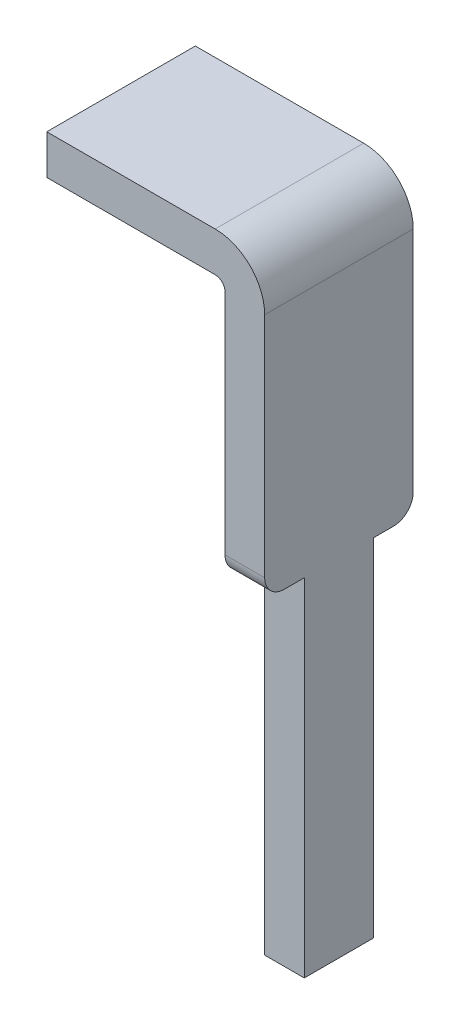
ISO-10303-21;
HEADER;
FILE_DESCRIPTION(('STEP AP214'),'2;1');
FILE_NAME('part.step','',(''),(''),'','','');
FILE_SCHEMA(('AUTOMOTIVE_DESIGN { 1 0 10303 214 1 1 1 1 }'));
ENDSEC;
DATA;
#1=APPLICATION_CONTEXT('core data for automotive mechanical design processes');
#2=APPLICATION_PROTOCOL_DEFINITION('international standard','automotive_design',2000,#1);
#3=PRODUCT_CONTEXT('',#1,'mechanical');
#4=PRODUCT('Part','Part','',(#3));
#5=PRODUCT_RELATED_PRODUCT_CATEGORY('part','',(#4));
#6=PRODUCT_DEFINITION_FORMATION('','',#4);
#7=PRODUCT_DEFINITION_CONTEXT('part definition',#1,'design');
#8=PRODUCT_DEFINITION('design','',#6,#7);
#9=PRODUCT_DEFINITION_SHAPE('','',#8);
#10=(LENGTH_UNIT() NAMED_UNIT(*) SI_UNIT(.MILLI.,.METRE.));
#11=(NAMED_UNIT(*) PLANE_ANGLE_UNIT() SI_UNIT($,.RADIAN.));
#12=(NAMED_UNIT(*) SI_UNIT($,.STERADIAN.) SOLID_ANGLE_UNIT());
#13=UNCERTAINTY_MEASURE_WITH_UNIT(LENGTH_MEASURE(1.E-05),#10,'distance_accuracy_value','');
#14=(GEOMETRIC_REPRESENTATION_CONTEXT(3) GLOBAL_UNCERTAINTY_ASSIGNED_CONTEXT((#13)) GLOBAL_UNIT_ASSIGNED_CONTEXT((#10,
#11,#12)) REPRESENTATION_CONTEXT('',''));
#15=CARTESIAN_POINT('',(0.,0.,0.));
#16=DIRECTION('',(0.,0.,1.));
#17=DIRECTION('',(1.,0.,0.));
#18=AXIS2_PLACEMENT_3D('',#15,#16,#17);
#19=CARTESIAN_POINT('',(0.,-0.4,1.5));
#20=DIRECTION('',(0.,1.,0.));
#21=DIRECTION('',(0.,0.,1.));
#22=AXIS2_PLACEMENT_3D('',#19,#20,#21);
#23=PLANE('',#22);
#24=DIRECTION('',(0.,0.,1.));
#25=VECTOR('',#24,1.);
#26=CARTESIAN_POINT('',(1.3,-0.4,1.5));
#27=LINE('',#26,#25);
#28=CARTESIAN_POINT('',(1.3,-0.4,0.));
#29=VERTEX_POINT('',#28);
#30=CARTESIAN_POINT('',(1.3,-0.4,1.5));
#31=VERTEX_POINT('',#30);
#32=EDGE_CURVE('E133',#29,#31,#27,.T.);
#33=ORIENTED_EDGE('',*,*,#32,.F.);
#34=DIRECTION('',(1.,0.,0.));
#35=VECTOR('',#34,1.);
#36=CARTESIAN_POINT('',(0.,-0.4,0.));
#37=LINE('',#36,#35);
#38=CARTESIAN_POINT('',(3.,-0.4,0.));
#39=VERTEX_POINT('',#38);
#40=EDGE_CURVE('E142',#29,#39,#37,.T.);
#41=ORIENTED_EDGE('',*,*,#40,.T.);
#42=DIRECTION('',(0.,0.,-1.));
#43=VECTOR('',#42,1.);
#44=CARTESIAN_POINT('',(3.,-0.4,1.5));
#45=LINE('',#44,#43);
#46=CARTESIAN_POINT('',(3.,-0.4,1.5));
#47=VERTEX_POINT('',#46);
#48=EDGE_CURVE('E183',#47,#39,#45,.T.);
#49=ORIENTED_EDGE('',*,*,#48,.F.);
#50=DIRECTION('',(1.,0.,0.));
#51=VECTOR('',#50,1.);
#52=CARTESIAN_POINT('',(0.,-0.4,1.5));
#53=LINE('',#52,#51);
#54=EDGE_CURVE('E144',#31,#47,#53,.T.);
#55=ORIENTED_EDGE('',*,*,#54,.F.);
#56=EDGE_LOOP('',(#33,#41,#49,#55));
#57=FACE_BOUND('',#56,.T.);
#58=ADVANCED_FACE('F32',(#57),#23,.F.);
#59=CARTESIAN_POINT('',(0.,0.,1.5));
#60=DIRECTION('',(0.,-1.,0.));
#61=DIRECTION('',(0.,0.,-1.));
#62=AXIS2_PLACEMENT_3D('',#59,#60,#61);
#63=PLANE('',#62);
#64=DIRECTION('',(0.,0.,-1.));
#65=VECTOR('',#64,1.);
#66=CARTESIAN_POINT('',(1.3,0.,1.5));
#67=LINE('',#66,#65);
#68=CARTESIAN_POINT('',(1.3,0.,1.5));
#69=VERTEX_POINT('',#68);
#70=CARTESIAN_POINT('',(1.3,0.,0.));
#71=VERTEX_POINT('',#70);
#72=EDGE_CURVE('E47',#69,#71,#67,.T.);
#73=ORIENTED_EDGE('',*,*,#72,.F.);
#74=DIRECTION('',(-1.,0.,0.));
#75=VECTOR('',#74,1.);
#76=CARTESIAN_POINT('',(0.,0.,1.5));
#77=LINE('',#76,#75);
#78=CARTESIAN_POINT('',(3.,0.,1.5));
#79=VERTEX_POINT('',#78);
#80=EDGE_CURVE('E158',#79,#69,#77,.T.);
#81=ORIENTED_EDGE('',*,*,#80,.F.);
#82=DIRECTION('',(0.,0.,-1.));
#83=VECTOR('',#82,1.);
#84=CARTESIAN_POINT('',(3.,0.,1.5));
#85=LINE('',#84,#83);
#86=CARTESIAN_POINT('',(3.,0.,0.));
#87=VERTEX_POINT('',#86);
#88=EDGE_CURVE('E168',#79,#87,#85,.T.);
#89=ORIENTED_EDGE('',*,*,#88,.T.);
#90=DIRECTION('',(-1.,0.,0.));
#91=VECTOR('',#90,1.);
#92=CARTESIAN_POINT('',(0.,0.,0.));
#93=LINE('',#92,#91);
#94=EDGE_CURVE('E166',#87,#71,#93,.T.);
#95=ORIENTED_EDGE('',*,*,#94,.T.);
#96=EDGE_LOOP('',(#73,#81,#89,#95));
#97=FACE_BOUND('',#96,.T.);
#98=ADVANCED_FACE('F254',(#97),#63,.F.);
#99=CARTESIAN_POINT('',(3.,-0.5,1.5));
#100=DIRECTION('',(0.,0.,-1.));
#101=DIRECTION('',(-1.,0.,0.));
#102=AXIS2_PLACEMENT_3D('',#99,#100,#101);
#103=PLANE('',#102);
#104=DIRECTION('',(0.,1.,0.));
#105=VECTOR('',#104,1.);
#106=CARTESIAN_POINT('',(1.3,0.,1.5));
#107=LINE('',#106,#105);
#108=EDGE_CURVE('E145',#31,#69,#107,.T.);
#109=ORIENTED_EDGE('',*,*,#108,.F.);
#110=ORIENTED_EDGE('',*,*,#54,.T.);
#111=CARTESIAN_POINT('',(3.,-0.5,1.5));
#112=DIRECTION('',(0.,0.,-1.));
#113=DIRECTION('',(-1.,0.,0.));
#114=AXIS2_PLACEMENT_3D('',#111,#112,#113);
#115=CIRCLE('',#114,0.1);
#116=CARTESIAN_POINT('',(3.1,-0.5,1.5));
#117=VERTEX_POINT('',#116);
#118=EDGE_CURVE('E240',#47,#117,#115,.T.);
#119=ORIENTED_EDGE('',*,*,#118,.T.);
#120=DIRECTION('',(0.,-1.,0.));
#121=VECTOR('',#120,1.);
#122=CARTESIAN_POINT('',(3.1,-0.5,1.5));
#123=LINE('',#122,#121);
#124=CARTESIAN_POINT('',(3.1,-2.8,1.5));
#125=VERTEX_POINT('',#124);
#126=EDGE_CURVE('E242',#117,#125,#123,.T.);
#127=ORIENTED_EDGE('',*,*,#126,.T.);
#128=DIRECTION('',(1.,0.,0.));
#129=VECTOR('',#128,1.);
#130=CARTESIAN_POINT('',(3.,-2.8,1.5));
#131=LINE('',#130,#129);
#132=CARTESIAN_POINT('',(3.5,-2.8,1.5));
#133=VERTEX_POINT('',#132);
#134=EDGE_CURVE('E185',#125,#133,#131,.T.);
#135=ORIENTED_EDGE('',*,*,#134,.T.);
#136=DIRECTION('',(0.,1.,0.));
#137=VECTOR('',#136,1.);
#138=CARTESIAN_POINT('',(3.5,-0.5,1.5));
#139=LINE('',#138,#137);
#140=CARTESIAN_POINT('',(3.5,-0.5,1.5));
#141=VERTEX_POINT('',#140);
#142=EDGE_CURVE('E245',#133,#141,#139,.T.);
#143=ORIENTED_EDGE('',*,*,#142,.T.);
#144=CARTESIAN_POINT('',(3.,-0.5,1.5));
#145=DIRECTION('',(0.,0.,1.));
#146=DIRECTION('',(-1.,0.,0.));
#147=AXIS2_PLACEMENT_3D('',#144,#145,#146);
#148=CIRCLE('',#147,0.5);
#149=EDGE_CURVE('E246',#141,#79,#148,.T.);
#150=ORIENTED_EDGE('',*,*,#149,.T.);
#151=ORIENTED_EDGE('',*,*,#80,.T.);
#152=EDGE_LOOP('',(#109,#110,#119,#127,#135,#143,#150,#151));
#153=FACE_BOUND('',#152,.T.);
#154=ADVANCED_FACE('F252',(#153),#103,.F.);
#155=CARTESIAN_POINT('',(3.,-0.5,0.));
#156=DIRECTION('',(0.,0.,-1.));
#157=DIRECTION('',(-1.,0.,0.));
#158=AXIS2_PLACEMENT_3D('',#155,#156,#157);
#159=PLANE('',#158);
#160=ORIENTED_EDGE('',*,*,#40,.F.);
#161=DIRECTION('',(0.,-1.,0.));
#162=VECTOR('',#161,1.);
#163=CARTESIAN_POINT('',(1.3,0.,0.));
#164=LINE('',#163,#162);
#165=EDGE_CURVE('E130',#71,#29,#164,.T.);
#166=ORIENTED_EDGE('',*,*,#165,.F.);
#167=ORIENTED_EDGE('',*,*,#94,.F.);
#168=CARTESIAN_POINT('',(3.,-0.5,0.));
#169=DIRECTION('',(0.,0.,1.));
#170=DIRECTION('',(-1.,0.,0.));
#171=AXIS2_PLACEMENT_3D('',#168,#169,#170);
#172=CIRCLE('',#171,0.5);
#173=CARTESIAN_POINT('',(3.5,-0.5,0.));
#174=VERTEX_POINT('',#173);
#175=EDGE_CURVE('E164',#174,#87,#172,.T.);
#176=ORIENTED_EDGE('',*,*,#175,.F.);
#177=DIRECTION('',(0.,1.,0.));
#178=VECTOR('',#177,1.);
#179=CARTESIAN_POINT('',(3.5,-0.5,0.));
#180=LINE('',#179,#178);
#181=CARTESIAN_POINT('',(3.5,-2.8,0.));
#182=VERTEX_POINT('',#181);
#183=EDGE_CURVE('E162',#182,#174,#180,.T.);
#184=ORIENTED_EDGE('',*,*,#183,.F.);
#185=DIRECTION('',(1.,0.,0.));
#186=VECTOR('',#185,1.);
#187=CARTESIAN_POINT('',(3.1,-2.8,0.));
#188=LINE('',#187,#186);
#189=CARTESIAN_POINT('',(3.1,-2.8,0.));
#190=VERTEX_POINT('',#189);
#191=EDGE_CURVE('E11',#182,#190,#188,.F.);
#192=ORIENTED_EDGE('',*,*,#191,.T.);
#193=DIRECTION('',(0.,-1.,0.));
#194=VECTOR('',#193,1.);
#195=CARTESIAN_POINT('',(3.1,-0.5,0.));
#196=LINE('',#195,#194);
#197=CARTESIAN_POINT('',(3.1,-0.5,0.));
#198=VERTEX_POINT('',#197);
#199=EDGE_CURVE('E152',#198,#190,#196,.T.);
#200=ORIENTED_EDGE('',*,*,#199,.F.);
#201=CARTESIAN_POINT('',(3.,-0.5,0.));
#202=DIRECTION('',(0.,0.,-1.));
#203=DIRECTION('',(-1.,0.,0.));
#204=AXIS2_PLACEMENT_3D('',#201,#202,#203);
#205=CIRCLE('',#204,0.1);
#206=EDGE_CURVE('E149',#39,#198,#205,.T.);
#207=ORIENTED_EDGE('',*,*,#206,.F.);
#208=EDGE_LOOP('',(#160,#166,#167,#176,#184,#192,#200,#207));
#209=FACE_BOUND('',#208,.T.);
#210=ADVANCED_FACE('F148',(#209),#159,.T.);
#211=CARTESIAN_POINT('',(3.,-0.5,1.5));
#212=DIRECTION('',(0.,0.,-1.));
#213=DIRECTION('',(-1.,0.,0.));
#214=AXIS2_PLACEMENT_3D('',#211,#212,#213);
#215=CYLINDRICAL_SURFACE('',#214,0.1);
#216=ORIENTED_EDGE('',*,*,#206,.T.);
#217=DIRECTION('',(0.,0.,-1.));
#218=VECTOR('',#217,1.);
#219=CARTESIAN_POINT('',(3.1,-0.5,1.5));
#220=LINE('',#219,#218);
#221=EDGE_CURVE('E180',#117,#198,#220,.T.);
#222=ORIENTED_EDGE('',*,*,#221,.F.);
#223=ORIENTED_EDGE('',*,*,#118,.F.);
#224=ORIENTED_EDGE('',*,*,#48,.T.);
#225=EDGE_LOOP('',(#216,#222,#223,#224));
#226=FACE_BOUND('',#225,.T.);
#227=ADVANCED_FACE('F296',(#226),#215,.F.);
#228=CARTESIAN_POINT('',(3.1,-0.5,1.5));
#229=DIRECTION('',(1.,0.,0.));
#230=DIRECTION('',(0.,0.,-1.));
#231=AXIS2_PLACEMENT_3D('',#228,#229,#230);
#232=PLANE('',#231);
#233=DIRECTION('',(0.,0.,1.));
#234=VECTOR('',#233,1.);
#235=CARTESIAN_POINT('',(3.1,-3.,1.5));
#236=LINE('',#235,#234);
#237=CARTESIAN_POINT('',(3.1,-3.,1.1));
#238=VERTEX_POINT('',#237);
#239=CARTESIAN_POINT('',(3.1,-3.,1.3));
#240=VERTEX_POINT('',#239);
#241=EDGE_CURVE('E155',#238,#240,#236,.T.);
#242=ORIENTED_EDGE('',*,*,#241,.T.);
#243=CARTESIAN_POINT('',(3.1,-2.8,1.3));
#244=DIRECTION('',(1.,0.,0.));
#245=DIRECTION('',(0.,0.,-1.));
#246=AXIS2_PLACEMENT_3D('',#243,#244,#245);
#247=CIRCLE('',#246,0.2);
#248=EDGE_CURVE('E196',#240,#125,#247,.F.);
#249=ORIENTED_EDGE('',*,*,#248,.T.);
#250=ORIENTED_EDGE('',*,*,#126,.F.);
#251=ORIENTED_EDGE('',*,*,#221,.T.);
#252=ORIENTED_EDGE('',*,*,#199,.T.);
#253=CARTESIAN_POINT('',(3.1,-2.8,0.2));
#254=DIRECTION('',(1.,0.,0.));
#255=DIRECTION('',(0.,0.,-1.));
#256=AXIS2_PLACEMENT_3D('',#253,#254,#255);
#257=CIRCLE('',#256,0.2);
#258=CARTESIAN_POINT('',(3.1,-3.,0.2));
#259=VERTEX_POINT('',#258);
#260=EDGE_CURVE('E194',#190,#259,#257,.F.);
#261=ORIENTED_EDGE('',*,*,#260,.T.);
#262=DIRECTION('',(0.,0.,1.));
#263=VECTOR('',#262,1.);
#264=CARTESIAN_POINT('',(3.1,-3.,1.5));
#265=LINE('',#264,#263);
#266=CARTESIAN_POINT('',(3.1,-3.,0.4));
#267=VERTEX_POINT('',#266);
#268=EDGE_CURVE('E206',#259,#267,#265,.T.);
#269=ORIENTED_EDGE('',*,*,#268,.T.);
#270=DIRECTION('',(0.,-1.,0.));
#271=VECTOR('',#270,1.);
#272=CARTESIAN_POINT('',(3.1,-0.5,0.4));
#273=LINE('',#272,#271);
#274=CARTESIAN_POINT('',(3.1,-6.5,0.4));
#275=VERTEX_POINT('',#274);
#276=EDGE_CURVE('E224',#267,#275,#273,.T.);
#277=ORIENTED_EDGE('',*,*,#276,.T.);
#278=DIRECTION('',(0.,0.,-1.));
#279=VECTOR('',#278,1.);
#280=CARTESIAN_POINT('',(3.1,-6.5,1.5));
#281=LINE('',#280,#279);
#282=CARTESIAN_POINT('',(3.1,-6.5,1.1));
#283=VERTEX_POINT('',#282);
#284=EDGE_CURVE('E177',#283,#275,#281,.T.);
#285=ORIENTED_EDGE('',*,*,#284,.F.);
#286=DIRECTION('',(0.,1.,0.));
#287=VECTOR('',#286,1.);
#288=CARTESIAN_POINT('',(3.1,-0.5,1.1));
#289=LINE('',#288,#287);
#290=EDGE_CURVE('E150',#283,#238,#289,.T.);
#291=ORIENTED_EDGE('',*,*,#290,.T.);
#292=EDGE_LOOP('',(#242,#249,#250,#251,#252,#261,#269,#277,#285,#291));
#293=FACE_BOUND('',#292,.T.);
#294=ADVANCED_FACE('F271',(#293),#232,.F.);
#295=CARTESIAN_POINT('',(3.1,-6.5,1.5));
#296=DIRECTION('',(0.,1.,0.));
#297=DIRECTION('',(0.,0.,1.));
#298=AXIS2_PLACEMENT_3D('',#295,#296,#297);
#299=PLANE('',#298);
#300=ORIENTED_EDGE('',*,*,#284,.T.);
#301=DIRECTION('',(1.,0.,0.));
#302=VECTOR('',#301,1.);
#303=CARTESIAN_POINT('',(2.,-6.5,0.4));
#304=LINE('',#303,#302);
#305=CARTESIAN_POINT('',(3.5,-6.5,0.4));
#306=VERTEX_POINT('',#305);
#307=EDGE_CURVE('E219',#275,#306,#304,.T.);
#308=ORIENTED_EDGE('',*,*,#307,.T.);
#309=DIRECTION('',(0.,0.,-1.));
#310=VECTOR('',#309,1.);
#311=CARTESIAN_POINT('',(3.5,-6.5,1.5));
#312=LINE('',#311,#310);
#313=CARTESIAN_POINT('',(3.5,-6.5,1.1));
#314=VERTEX_POINT('',#313);
#315=EDGE_CURVE('E174',#314,#306,#312,.T.);
#316=ORIENTED_EDGE('',*,*,#315,.F.);
#317=DIRECTION('',(1.,0.,0.));
#318=VECTOR('',#317,1.);
#319=CARTESIAN_POINT('',(2.,-6.5,1.1));
#320=LINE('',#319,#318);
#321=EDGE_CURVE('E233',#283,#314,#320,.T.);
#322=ORIENTED_EDGE('',*,*,#321,.F.);
#323=EDGE_LOOP('',(#300,#308,#316,#322));
#324=FACE_BOUND('',#323,.T.);
#325=ADVANCED_FACE('F279',(#324),#299,.F.);
#326=CARTESIAN_POINT('',(3.5,-0.5,1.5));
#327=DIRECTION('',(-1.,0.,0.));
#328=DIRECTION('',(0.,-1.,0.));
#329=AXIS2_PLACEMENT_3D('',#326,#327,#328);
#330=PLANE('',#329);
#331=ORIENTED_EDGE('',*,*,#142,.F.);
#332=CARTESIAN_POINT('',(3.5,-2.8,1.3));
#333=DIRECTION('',(-1.,0.,0.));
#334=DIRECTION('',(0.,-1.,0.));
#335=AXIS2_PLACEMENT_3D('',#332,#333,#334);
#336=CIRCLE('',#335,0.2);
#337=CARTESIAN_POINT('',(3.5,-3.,1.3));
#338=VERTEX_POINT('',#337);
#339=EDGE_CURVE('E190',#133,#338,#336,.F.);
#340=ORIENTED_EDGE('',*,*,#339,.T.);
#341=DIRECTION('',(0.,0.,1.));
#342=VECTOR('',#341,1.);
#343=CARTESIAN_POINT('',(3.5,-3.,1.5));
#344=LINE('',#343,#342);
#345=CARTESIAN_POINT('',(3.5,-3.,1.1));
#346=VERTEX_POINT('',#345);
#347=EDGE_CURVE('E230',#346,#338,#344,.T.);
#348=ORIENTED_EDGE('',*,*,#347,.F.);
#349=DIRECTION('',(0.,1.,0.));
#350=VECTOR('',#349,1.);
#351=CARTESIAN_POINT('',(3.5,-6.5,1.1));
#352=LINE('',#351,#350);
#353=EDGE_CURVE('E227',#314,#346,#352,.T.);
#354=ORIENTED_EDGE('',*,*,#353,.F.);
#355=ORIENTED_EDGE('',*,*,#315,.T.);
#356=DIRECTION('',(0.,-1.,0.));
#357=VECTOR('',#356,1.);
#358=CARTESIAN_POINT('',(3.5,-6.5,0.4));
#359=LINE('',#358,#357);
#360=CARTESIAN_POINT('',(3.5,-3.,0.4));
#361=VERTEX_POINT('',#360);
#362=EDGE_CURVE('E213',#361,#306,#359,.T.);
#363=ORIENTED_EDGE('',*,*,#362,.F.);
#364=DIRECTION('',(0.,0.,1.));
#365=VECTOR('',#364,1.);
#366=CARTESIAN_POINT('',(3.5,-3.,0.));
#367=LINE('',#366,#365);
#368=CARTESIAN_POINT('',(3.5,-3.,0.2));
#369=VERTEX_POINT('',#368);
#370=EDGE_CURVE('E204',#369,#361,#367,.T.);
#371=ORIENTED_EDGE('',*,*,#370,.F.);
#372=CARTESIAN_POINT('',(3.5,-2.8,0.2));
#373=DIRECTION('',(-1.,0.,0.));
#374=DIRECTION('',(0.,-1.,0.));
#375=AXIS2_PLACEMENT_3D('',#372,#373,#374);
#376=CIRCLE('',#375,0.2);
#377=EDGE_CURVE('E188',#369,#182,#376,.F.);
#378=ORIENTED_EDGE('',*,*,#377,.T.);
#379=ORIENTED_EDGE('',*,*,#183,.T.);
#380=DIRECTION('',(0.,0.,-1.));
#381=VECTOR('',#380,1.);
#382=CARTESIAN_POINT('',(3.5,-0.5,1.5));
#383=LINE('',#382,#381);
#384=EDGE_CURVE('E171',#141,#174,#383,.T.);
#385=ORIENTED_EDGE('',*,*,#384,.F.);
#386=EDGE_LOOP('',(#331,#340,#348,#354,#355,#363,#371,#378,#379,#385));
#387=FACE_BOUND('',#386,.T.);
#388=ADVANCED_FACE('F212',(#387),#330,.F.);
#389=CARTESIAN_POINT('',(3.,-0.5,1.5));
#390=DIRECTION('',(0.,0.,-1.));
#391=DIRECTION('',(-1.,0.,0.));
#392=AXIS2_PLACEMENT_3D('',#389,#390,#391);
#393=CYLINDRICAL_SURFACE('',#392,0.5);
#394=ORIENTED_EDGE('',*,*,#175,.T.);
#395=ORIENTED_EDGE('',*,*,#88,.F.);
#396=ORIENTED_EDGE('',*,*,#149,.F.);
#397=ORIENTED_EDGE('',*,*,#384,.T.);
#398=EDGE_LOOP('',(#394,#395,#396,#397));
#399=FACE_BOUND('',#398,.T.);
#400=ADVANCED_FACE('F258',(#399),#393,.T.);
#401=CARTESIAN_POINT('',(2.,-6.5,1.1));
#402=DIRECTION('',(0.,0.,-1.));
#403=DIRECTION('',(-1.,0.,0.));
#404=AXIS2_PLACEMENT_3D('',#401,#402,#403);
#405=PLANE('',#404);
#406=ORIENTED_EDGE('',*,*,#321,.T.);
#407=ORIENTED_EDGE('',*,*,#353,.T.);
#408=DIRECTION('',(1.,0.,0.));
#409=VECTOR('',#408,1.);
#410=CARTESIAN_POINT('',(2.,-3.,1.1));
#411=LINE('',#410,#409);
#412=EDGE_CURVE('E234',#238,#346,#411,.T.);
#413=ORIENTED_EDGE('',*,*,#412,.F.);
#414=ORIENTED_EDGE('',*,*,#290,.F.);
#415=EDGE_LOOP('',(#406,#407,#413,#414));
#416=FACE_BOUND('',#415,.T.);
#417=ADVANCED_FACE('F275',(#416),#405,.F.);
#418=CARTESIAN_POINT('',(2.,-3.,1.5));
#419=DIRECTION('',(0.,1.,0.));
#420=DIRECTION('',(-1.,0.,0.));
#421=AXIS2_PLACEMENT_3D('',#418,#419,#420);
#422=PLANE('',#421);
#423=ORIENTED_EDGE('',*,*,#347,.T.);
#424=DIRECTION('',(1.,0.,0.));
#425=VECTOR('',#424,1.);
#426=CARTESIAN_POINT('',(2.,-3.,1.3));
#427=LINE('',#426,#425);
#428=EDGE_CURVE('E192',#338,#240,#427,.F.);
#429=ORIENTED_EDGE('',*,*,#428,.T.);
#430=ORIENTED_EDGE('',*,*,#241,.F.);
#431=ORIENTED_EDGE('',*,*,#412,.T.);
#432=EDGE_LOOP('',(#423,#429,#430,#431));
#433=FACE_BOUND('',#432,.T.);
#434=ADVANCED_FACE('F268',(#433),#422,.F.);
#435=CARTESIAN_POINT('',(2.,-6.5,0.4));
#436=DIRECTION('',(0.,0.,1.));
#437=DIRECTION('',(1.,0.,0.));
#438=AXIS2_PLACEMENT_3D('',#435,#436,#437);
#439=PLANE('',#438);
#440=DIRECTION('',(1.,0.,0.));
#441=VECTOR('',#440,1.);
#442=CARTESIAN_POINT('',(2.,-3.,0.4));
#443=LINE('',#442,#441);
#444=EDGE_CURVE('E215',#267,#361,#443,.T.);
#445=ORIENTED_EDGE('',*,*,#444,.T.);
#446=ORIENTED_EDGE('',*,*,#362,.T.);
#447=ORIENTED_EDGE('',*,*,#307,.F.);
#448=ORIENTED_EDGE('',*,*,#276,.F.);
#449=EDGE_LOOP('',(#445,#446,#447,#448));
#450=FACE_BOUND('',#449,.T.);
#451=ADVANCED_FACE('F282',(#450),#439,.F.);
#452=CARTESIAN_POINT('',(2.,-3.,0.));
#453=DIRECTION('',(0.,1.,0.));
#454=DIRECTION('',(-1.,0.,0.));
#455=AXIS2_PLACEMENT_3D('',#452,#453,#454);
#456=PLANE('',#455);
#457=ORIENTED_EDGE('',*,*,#268,.F.);
#458=DIRECTION('',(1.,0.,0.));
#459=VECTOR('',#458,1.);
#460=CARTESIAN_POINT('',(3.5,-3.,0.2));
#461=LINE('',#460,#459);
#462=EDGE_CURVE('E40',#259,#369,#461,.T.);
#463=ORIENTED_EDGE('',*,*,#462,.T.);
#464=ORIENTED_EDGE('',*,*,#370,.T.);
#465=ORIENTED_EDGE('',*,*,#444,.F.);
#466=EDGE_LOOP('',(#457,#463,#464,#465));
#467=FACE_BOUND('',#466,.T.);
#468=ADVANCED_FACE('F202',(#467),#456,.F.);
#469=CARTESIAN_POINT('',(3.,-2.8,1.3));
#470=DIRECTION('',(1.,0.,0.));
#471=DIRECTION('',(0.,1.,0.));
#472=AXIS2_PLACEMENT_3D('',#469,#470,#471);
#473=CYLINDRICAL_SURFACE('',#472,0.2);
#474=ORIENTED_EDGE('',*,*,#248,.F.);
#475=ORIENTED_EDGE('',*,*,#428,.F.);
#476=ORIENTED_EDGE('',*,*,#339,.F.);
#477=ORIENTED_EDGE('',*,*,#134,.F.);
#478=EDGE_LOOP('',(#474,#475,#476,#477));
#479=FACE_BOUND('',#478,.T.);
#480=ADVANCED_FACE('F265',(#479),#473,.T.);
#481=CARTESIAN_POINT('',(2.,-2.8,0.2));
#482=DIRECTION('',(-1.,0.,0.));
#483=DIRECTION('',(0.,-1.,0.));
#484=AXIS2_PLACEMENT_3D('',#481,#482,#483);
#485=CYLINDRICAL_SURFACE('',#484,0.2);
#486=ORIENTED_EDGE('',*,*,#260,.F.);
#487=ORIENTED_EDGE('',*,*,#191,.F.);
#488=ORIENTED_EDGE('',*,*,#377,.F.);
#489=ORIENTED_EDGE('',*,*,#462,.F.);
#490=EDGE_LOOP('',(#486,#487,#488,#489));
#491=FACE_BOUND('',#490,.T.);
#492=ADVANCED_FACE('F34',(#491),#485,.T.);
#493=CARTESIAN_POINT('',(1.3,0.,0.));
#494=DIRECTION('',(-1.,0.,0.));
#495=DIRECTION('',(0.,0.,1.));
#496=AXIS2_PLACEMENT_3D('',#493,#494,#495);
#497=PLANE('',#496);
#498=ORIENTED_EDGE('',*,*,#72,.T.);
#499=ORIENTED_EDGE('',*,*,#165,.T.);
#500=ORIENTED_EDGE('',*,*,#32,.T.);
#501=ORIENTED_EDGE('',*,*,#108,.T.);
#502=EDGE_LOOP('',(#498,#499,#500,#501));
#503=FACE_BOUND('',#502,.T.);
#504=ADVANCED_FACE('F132',(#503),#497,.T.);
#505=CLOSED_SHELL('',(#58,#98,#154,#210,#227,#294,#325,#388,#400,#417,#434,#451,#468,#480,#492,#504));
#506=MANIFOLD_SOLID_BREP('B2',#505);
#507=ADVANCED_BREP_SHAPE_REPRESENTATION('',(#18,#506),#14);
#508=SHAPE_DEFINITION_REPRESENTATION(#9,#507);
ENDSEC;
END-ISO-10303-21;
